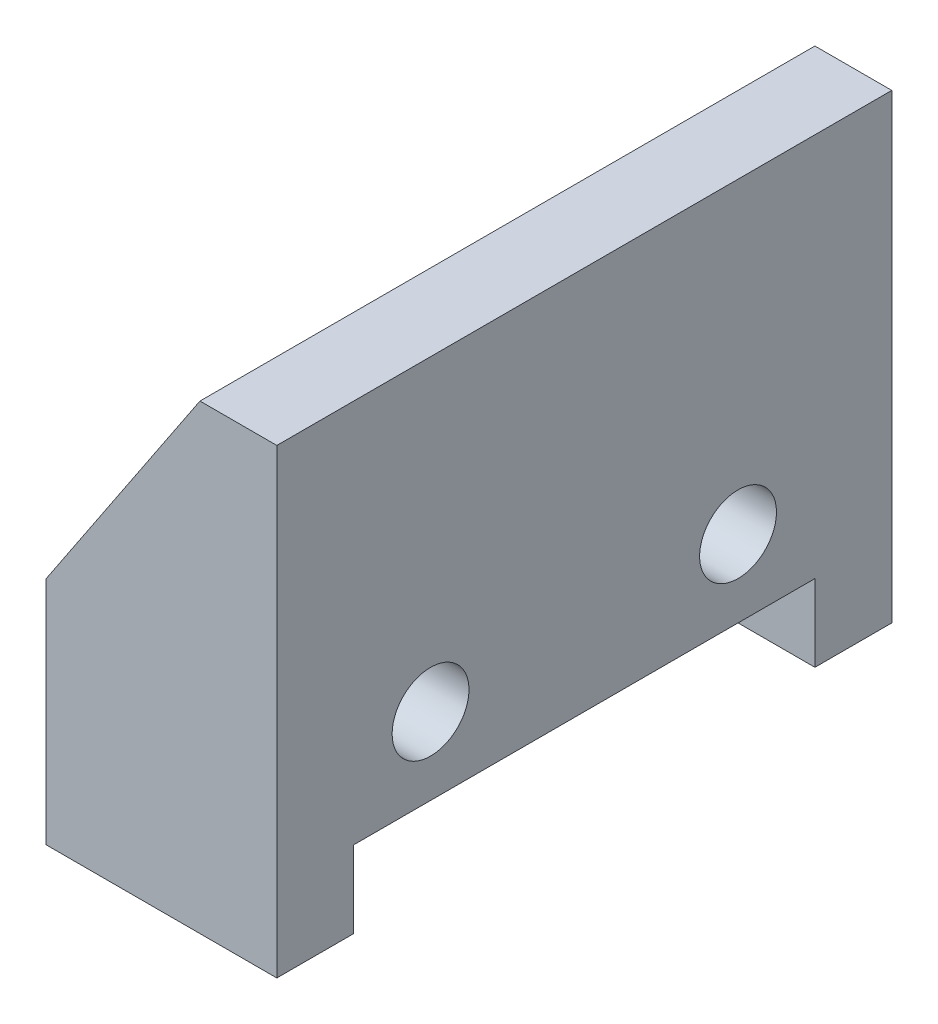
ISO-10303-21;
HEADER;
FILE_DESCRIPTION(('STEP AP214'),'2;1');
FILE_NAME('part.step','',(''),(''),'','','');
FILE_SCHEMA(('AUTOMOTIVE_DESIGN { 1 0 10303 214 1 1 1 1 }'));
ENDSEC;
DATA;
#1=APPLICATION_CONTEXT('core data for automotive mechanical design processes');
#2=APPLICATION_PROTOCOL_DEFINITION('international standard','automotive_design',2000,#1);
#3=PRODUCT_CONTEXT('',#1,'mechanical');
#4=PRODUCT('Part','Part','',(#3));
#5=PRODUCT_RELATED_PRODUCT_CATEGORY('part','',(#4));
#6=PRODUCT_DEFINITION_FORMATION('','',#4);
#7=PRODUCT_DEFINITION_CONTEXT('part definition',#1,'design');
#8=PRODUCT_DEFINITION('design','',#6,#7);
#9=PRODUCT_DEFINITION_SHAPE('','',#8);
#10=(LENGTH_UNIT() NAMED_UNIT(*) SI_UNIT(.MILLI.,.METRE.));
#11=(NAMED_UNIT(*) PLANE_ANGLE_UNIT() SI_UNIT($,.RADIAN.));
#12=(NAMED_UNIT(*) SI_UNIT($,.STERADIAN.) SOLID_ANGLE_UNIT());
#13=UNCERTAINTY_MEASURE_WITH_UNIT(LENGTH_MEASURE(1.E-05),#10,'distance_accuracy_value','');
#14=(GEOMETRIC_REPRESENTATION_CONTEXT(3) GLOBAL_UNCERTAINTY_ASSIGNED_CONTEXT((#13)) GLOBAL_UNIT_ASSIGNED_CONTEXT((#10,
#11,#12)) REPRESENTATION_CONTEXT('',''));
#15=CARTESIAN_POINT('',(0.,0.,0.));
#16=DIRECTION('',(0.,0.,1.));
#17=DIRECTION('',(1.,0.,0.));
#18=AXIS2_PLACEMENT_3D('',#15,#16,#17);
#19=CARTESIAN_POINT('',(0.,0.,20.));
#20=DIRECTION('',(0.,1.,0.));
#21=DIRECTION('',(0.,0.,1.));
#22=AXIS2_PLACEMENT_3D('',#19,#20,#21);
#23=PLANE('',#22);
#24=DIRECTION('',(0.,0.,-1.));
#25=VECTOR('',#24,1.);
#26=CARTESIAN_POINT('',(0.,0.,20.));
#27=LINE('',#26,#25);
#28=CARTESIAN_POINT('',(0.,0.,20.));
#29=VERTEX_POINT('',#28);
#30=CARTESIAN_POINT('',(0.,0.,15.));
#31=VERTEX_POINT('',#30);
#32=EDGE_CURVE('E11',#29,#31,#27,.T.);
#33=ORIENTED_EDGE('',*,*,#32,.T.);
#34=DIRECTION('',(1.,0.,0.));
#35=VECTOR('',#34,1.);
#36=CARTESIAN_POINT('',(0.,0.,15.));
#37=LINE('',#36,#35);
#38=CARTESIAN_POINT('',(15.,0.,15.));
#39=VERTEX_POINT('',#38);
#40=EDGE_CURVE('E199',#31,#39,#37,.T.);
#41=ORIENTED_EDGE('',*,*,#40,.T.);
#42=DIRECTION('',(0.,0.,-1.));
#43=VECTOR('',#42,1.);
#44=CARTESIAN_POINT('',(15.,0.,20.));
#45=LINE('',#44,#43);
#46=CARTESIAN_POINT('',(15.,0.,20.));
#47=VERTEX_POINT('',#46);
#48=EDGE_CURVE('E155',#47,#39,#45,.T.);
#49=ORIENTED_EDGE('',*,*,#48,.F.);
#50=DIRECTION('',(1.,0.,0.));
#51=VECTOR('',#50,1.);
#52=CARTESIAN_POINT('',(0.,0.,20.));
#53=LINE('',#52,#51);
#54=EDGE_CURVE('E99',#29,#47,#53,.T.);
#55=ORIENTED_EDGE('',*,*,#54,.F.);
#56=EDGE_LOOP('',(#33,#41,#49,#55));
#57=FACE_BOUND('',#56,.T.);
#58=ADVANCED_FACE('F42',(#57),#23,.F.);
#59=CARTESIAN_POINT('',(0.,0.,20.));
#60=DIRECTION('',(1.,0.,0.));
#61=DIRECTION('',(0.,0.,-1.));
#62=AXIS2_PLACEMENT_3D('',#59,#60,#61);
#63=PLANE('',#62);
#64=CARTESIAN_POINT('',(0.,10.,10.));
#65=DIRECTION('',(1.,0.,0.));
#66=DIRECTION('',(0.,0.,1.));
#67=AXIS2_PLACEMENT_3D('',#64,#65,#66);
#68=CIRCLE('',#67,2.5);
#69=CARTESIAN_POINT('',(0.,10.,12.5));
#70=VERTEX_POINT('',#69);
#71=EDGE_CURVE('E204',#70,#70,#68,.T.);
#72=ORIENTED_EDGE('',*,*,#71,.T.);
#73=EDGE_LOOP('',(#72));
#74=FACE_BOUND('',#73,.T.);
#75=CARTESIAN_POINT('',(0.,10.,-10.));
#76=DIRECTION('',(1.,0.,0.));
#77=DIRECTION('',(0.,0.,-1.));
#78=AXIS2_PLACEMENT_3D('',#75,#76,#77);
#79=CIRCLE('',#78,2.5);
#80=CARTESIAN_POINT('',(0.,10.,-12.5));
#81=VERTEX_POINT('',#80);
#82=EDGE_CURVE('E140',#81,#81,#79,.T.);
#83=ORIENTED_EDGE('',*,*,#82,.T.);
#84=EDGE_LOOP('',(#83));
#85=FACE_BOUND('',#84,.T.);
#86=DIRECTION('',(0.,0.,1.));
#87=VECTOR('',#86,1.);
#88=CARTESIAN_POINT('',(0.,5.00000000000001,15.));
#89=LINE('',#88,#87);
#90=CARTESIAN_POINT('',(0.,5.00000000000001,-15.));
#91=VERTEX_POINT('',#90);
#92=CARTESIAN_POINT('',(0.,5.00000000000001,15.));
#93=VERTEX_POINT('',#92);
#94=EDGE_CURVE('E196',#91,#93,#89,.T.);
#95=ORIENTED_EDGE('',*,*,#94,.T.);
#96=DIRECTION('',(0.,-1.,0.));
#97=VECTOR('',#96,1.);
#98=CARTESIAN_POINT('',(0.,0.,15.));
#99=LINE('',#98,#97);
#100=EDGE_CURVE('E188',#93,#31,#99,.T.);
#101=ORIENTED_EDGE('',*,*,#100,.T.);
#102=ORIENTED_EDGE('',*,*,#32,.F.);
#103=DIRECTION('',(0.,-1.,0.));
#104=VECTOR('',#103,1.);
#105=CARTESIAN_POINT('',(0.,0.,20.));
#106=LINE('',#105,#104);
#107=CARTESIAN_POINT('',(0.,15.,20.));
#108=VERTEX_POINT('',#107);
#109=EDGE_CURVE('E151',#108,#29,#106,.T.);
#110=ORIENTED_EDGE('',*,*,#109,.F.);
#111=DIRECTION('',(0.,0.,-1.));
#112=VECTOR('',#111,1.);
#113=CARTESIAN_POINT('',(0.,15.,20.));
#114=LINE('',#113,#112);
#115=CARTESIAN_POINT('',(0.,15.,-20.));
#116=VERTEX_POINT('',#115);
#117=EDGE_CURVE('E131',#108,#116,#114,.T.);
#118=ORIENTED_EDGE('',*,*,#117,.T.);
#119=DIRECTION('',(0.,-1.,0.));
#120=VECTOR('',#119,1.);
#121=CARTESIAN_POINT('',(0.,0.,-20.));
#122=LINE('',#121,#120);
#123=CARTESIAN_POINT('',(0.,0.,-20.));
#124=VERTEX_POINT('',#123);
#125=EDGE_CURVE('E135',#116,#124,#122,.T.);
#126=ORIENTED_EDGE('',*,*,#125,.T.);
#127=CARTESIAN_POINT('',(0.,0.,-15.));
#128=VERTEX_POINT('',#127);
#129=EDGE_CURVE('E51',#128,#124,#27,.T.);
#130=ORIENTED_EDGE('',*,*,#129,.F.);
#131=DIRECTION('',(0.,1.,0.));
#132=VECTOR('',#131,1.);
#133=CARTESIAN_POINT('',(0.,0.,-15.));
#134=LINE('',#133,#132);
#135=EDGE_CURVE('E192',#128,#91,#134,.T.);
#136=ORIENTED_EDGE('',*,*,#135,.T.);
#137=EDGE_LOOP('',(#95,#101,#102,#110,#118,#126,#130,#136));
#138=FACE_BOUND('',#137,.T.);
#139=ADVANCED_FACE('F44',(#74,#85,#138),#63,.F.);
#140=CARTESIAN_POINT('',(15.,0.,-15.));
#141=VERTEX_POINT('',#140);
#142=CARTESIAN_POINT('',(15.,0.,-20.));
#143=VERTEX_POINT('',#142);
#144=EDGE_CURVE('E124',#141,#143,#45,.T.);
#145=ORIENTED_EDGE('',*,*,#144,.F.);
#146=DIRECTION('',(1.,0.,0.));
#147=VECTOR('',#146,1.);
#148=CARTESIAN_POINT('',(0.,0.,-15.));
#149=LINE('',#148,#147);
#150=EDGE_CURVE('E58',#128,#141,#149,.T.);
#151=ORIENTED_EDGE('',*,*,#150,.F.);
#152=ORIENTED_EDGE('',*,*,#129,.T.);
#153=DIRECTION('',(1.,0.,0.));
#154=VECTOR('',#153,1.);
#155=CARTESIAN_POINT('',(0.,0.,-20.));
#156=LINE('',#155,#154);
#157=EDGE_CURVE('E139',#124,#143,#156,.T.);
#158=ORIENTED_EDGE('',*,*,#157,.T.);
#159=EDGE_LOOP('',(#145,#151,#152,#158));
#160=FACE_BOUND('',#159,.T.);
#161=ADVANCED_FACE('F165',(#160),#23,.F.);
#162=CARTESIAN_POINT('',(15.,0.,20.));
#163=DIRECTION('',(-1.,0.,0.));
#164=DIRECTION('',(0.,0.,1.));
#165=AXIS2_PLACEMENT_3D('',#162,#163,#164);
#166=PLANE('',#165);
#167=CARTESIAN_POINT('',(15.,10.,10.));
#168=DIRECTION('',(1.,0.,0.));
#169=DIRECTION('',(0.,0.,1.));
#170=AXIS2_PLACEMENT_3D('',#167,#168,#169);
#171=CIRCLE('',#170,2.5);
#172=CARTESIAN_POINT('',(15.,10.,12.5));
#173=VERTEX_POINT('',#172);
#174=EDGE_CURVE('E184',#173,#173,#171,.T.);
#175=ORIENTED_EDGE('',*,*,#174,.F.);
#176=EDGE_LOOP('',(#175));
#177=FACE_BOUND('',#176,.T.);
#178=CARTESIAN_POINT('',(15.,10.,-10.));
#179=DIRECTION('',(1.,0.,0.));
#180=DIRECTION('',(0.,0.,-1.));
#181=AXIS2_PLACEMENT_3D('',#178,#179,#180);
#182=CIRCLE('',#181,2.5);
#183=CARTESIAN_POINT('',(15.,10.,-12.5));
#184=VERTEX_POINT('',#183);
#185=EDGE_CURVE('E180',#184,#184,#182,.T.);
#186=ORIENTED_EDGE('',*,*,#185,.F.);
#187=EDGE_LOOP('',(#186));
#188=FACE_BOUND('',#187,.T.);
#189=ORIENTED_EDGE('',*,*,#48,.T.);
#190=DIRECTION('',(0.,-1.,0.));
#191=VECTOR('',#190,1.);
#192=CARTESIAN_POINT('',(15.,0.,15.));
#193=LINE('',#192,#191);
#194=CARTESIAN_POINT('',(15.,5.00000000000001,15.));
#195=VERTEX_POINT('',#194);
#196=EDGE_CURVE('E200',#195,#39,#193,.T.);
#197=ORIENTED_EDGE('',*,*,#196,.F.);
#198=DIRECTION('',(0.,0.,1.));
#199=VECTOR('',#198,1.);
#200=CARTESIAN_POINT('',(15.,5.00000000000001,15.));
#201=LINE('',#200,#199);
#202=CARTESIAN_POINT('',(15.,5.00000000000001,-15.));
#203=VERTEX_POINT('',#202);
#204=EDGE_CURVE('E191',#203,#195,#201,.T.);
#205=ORIENTED_EDGE('',*,*,#204,.F.);
#206=DIRECTION('',(0.,1.,0.));
#207=VECTOR('',#206,1.);
#208=CARTESIAN_POINT('',(15.,0.,-15.));
#209=LINE('',#208,#207);
#210=EDGE_CURVE('E162',#141,#203,#209,.T.);
#211=ORIENTED_EDGE('',*,*,#210,.F.);
#212=ORIENTED_EDGE('',*,*,#144,.T.);
#213=DIRECTION('',(0.,1.,0.));
#214=VECTOR('',#213,1.);
#215=CARTESIAN_POINT('',(15.,0.,-20.));
#216=LINE('',#215,#214);
#217=CARTESIAN_POINT('',(15.,30.,-20.));
#218=VERTEX_POINT('',#217);
#219=EDGE_CURVE('E120',#143,#218,#216,.T.);
#220=ORIENTED_EDGE('',*,*,#219,.T.);
#221=DIRECTION('',(0.,0.,-1.));
#222=VECTOR('',#221,1.);
#223=CARTESIAN_POINT('',(15.,30.,20.));
#224=LINE('',#223,#222);
#225=CARTESIAN_POINT('',(15.,30.,20.));
#226=VERTEX_POINT('',#225);
#227=EDGE_CURVE('E117',#226,#218,#224,.T.);
#228=ORIENTED_EDGE('',*,*,#227,.F.);
#229=DIRECTION('',(0.,1.,0.));
#230=VECTOR('',#229,1.);
#231=CARTESIAN_POINT('',(15.,0.,20.));
#232=LINE('',#231,#230);
#233=EDGE_CURVE('E106',#47,#226,#232,.T.);
#234=ORIENTED_EDGE('',*,*,#233,.F.);
#235=EDGE_LOOP('',(#189,#197,#205,#211,#212,#220,#228,#234));
#236=FACE_BOUND('',#235,.T.);
#237=ADVANCED_FACE('F118',(#177,#188,#236),#166,.F.);
#238=CARTESIAN_POINT('',(10.,30.,20.));
#239=DIRECTION('',(0.,-1.,0.));
#240=DIRECTION('',(0.,0.,-1.));
#241=AXIS2_PLACEMENT_3D('',#238,#239,#240);
#242=PLANE('',#241);
#243=DIRECTION('',(-1.,0.,0.));
#244=VECTOR('',#243,1.);
#245=CARTESIAN_POINT('',(10.,30.,-20.));
#246=LINE('',#245,#244);
#247=CARTESIAN_POINT('',(10.,30.,-20.));
#248=VERTEX_POINT('',#247);
#249=EDGE_CURVE('E146',#218,#248,#246,.T.);
#250=ORIENTED_EDGE('',*,*,#249,.T.);
#251=DIRECTION('',(0.,0.,-1.));
#252=VECTOR('',#251,1.);
#253=CARTESIAN_POINT('',(10.,30.,20.));
#254=LINE('',#253,#252);
#255=CARTESIAN_POINT('',(10.,30.,20.));
#256=VERTEX_POINT('',#255);
#257=EDGE_CURVE('E125',#256,#248,#254,.T.);
#258=ORIENTED_EDGE('',*,*,#257,.F.);
#259=DIRECTION('',(-1.,0.,0.));
#260=VECTOR('',#259,1.);
#261=CARTESIAN_POINT('',(10.,30.,20.));
#262=LINE('',#261,#260);
#263=EDGE_CURVE('E110',#226,#256,#262,.T.);
#264=ORIENTED_EDGE('',*,*,#263,.F.);
#265=ORIENTED_EDGE('',*,*,#227,.T.);
#266=EDGE_LOOP('',(#250,#258,#264,#265));
#267=FACE_BOUND('',#266,.T.);
#268=ADVANCED_FACE('F127',(#267),#242,.F.);
#269=CARTESIAN_POINT('',(0.,15.,20.));
#270=DIRECTION('',(0.832050294337844,-0.554700196225229,0.));
#271=DIRECTION('',(0.554700196225229,0.832050294337844,0.));
#272=AXIS2_PLACEMENT_3D('',#269,#270,#271);
#273=PLANE('',#272);
#274=DIRECTION('',(-0.554700196225229,-0.832050294337844,0.));
#275=VECTOR('',#274,1.);
#276=CARTESIAN_POINT('',(0.,15.,-20.));
#277=LINE('',#276,#275);
#278=EDGE_CURVE('E91',#248,#116,#277,.T.);
#279=ORIENTED_EDGE('',*,*,#278,.T.);
#280=ORIENTED_EDGE('',*,*,#117,.F.);
#281=DIRECTION('',(-0.554700196225229,-0.832050294337844,0.));
#282=VECTOR('',#281,1.);
#283=CARTESIAN_POINT('',(0.,15.,20.));
#284=LINE('',#283,#282);
#285=EDGE_CURVE('E67',#256,#108,#284,.T.);
#286=ORIENTED_EDGE('',*,*,#285,.F.);
#287=ORIENTED_EDGE('',*,*,#257,.T.);
#288=EDGE_LOOP('',(#279,#280,#286,#287));
#289=FACE_BOUND('',#288,.T.);
#290=ADVANCED_FACE('F170',(#289),#273,.F.);
#291=CARTESIAN_POINT('',(0.,0.,20.));
#292=DIRECTION('',(0.,0.,-1.));
#293=DIRECTION('',(-1.,0.,0.));
#294=AXIS2_PLACEMENT_3D('',#291,#292,#293);
#295=PLANE('',#294);
#296=ORIENTED_EDGE('',*,*,#109,.T.);
#297=ORIENTED_EDGE('',*,*,#54,.T.);
#298=ORIENTED_EDGE('',*,*,#233,.T.);
#299=ORIENTED_EDGE('',*,*,#263,.T.);
#300=ORIENTED_EDGE('',*,*,#285,.T.);
#301=EDGE_LOOP('',(#296,#297,#298,#299,#300));
#302=FACE_BOUND('',#301,.T.);
#303=ADVANCED_FACE('F108',(#302),#295,.F.);
#304=CARTESIAN_POINT('',(0.,0.,-20.));
#305=DIRECTION('',(0.,0.,-1.));
#306=DIRECTION('',(-1.,0.,0.));
#307=AXIS2_PLACEMENT_3D('',#304,#305,#306);
#308=PLANE('',#307);
#309=ORIENTED_EDGE('',*,*,#125,.F.);
#310=ORIENTED_EDGE('',*,*,#278,.F.);
#311=ORIENTED_EDGE('',*,*,#249,.F.);
#312=ORIENTED_EDGE('',*,*,#219,.F.);
#313=ORIENTED_EDGE('',*,*,#157,.F.);
#314=EDGE_LOOP('',(#309,#310,#311,#312,#313));
#315=FACE_BOUND('',#314,.T.);
#316=ADVANCED_FACE('F169',(#315),#308,.T.);
#317=CARTESIAN_POINT('',(0.,10.,-10.));
#318=DIRECTION('',(1.,0.,0.));
#319=DIRECTION('',(0.,0.,-1.));
#320=AXIS2_PLACEMENT_3D('',#317,#318,#319);
#321=CYLINDRICAL_SURFACE('',#320,2.5);
#322=ORIENTED_EDGE('',*,*,#82,.F.);
#323=EDGE_LOOP('',(#322));
#324=FACE_BOUND('',#323,.T.);
#325=ORIENTED_EDGE('',*,*,#185,.T.);
#326=EDGE_LOOP('',(#325));
#327=FACE_BOUND('',#326,.T.);
#328=ADVANCED_FACE('F237',(#324,#327),#321,.F.);
#329=CARTESIAN_POINT('',(0.,10.,10.));
#330=DIRECTION('',(1.,0.,0.));
#331=DIRECTION('',(0.,0.,-1.));
#332=AXIS2_PLACEMENT_3D('',#329,#330,#331);
#333=CYLINDRICAL_SURFACE('',#332,2.5);
#334=ORIENTED_EDGE('',*,*,#71,.F.);
#335=EDGE_LOOP('',(#334));
#336=FACE_BOUND('',#335,.T.);
#337=ORIENTED_EDGE('',*,*,#174,.T.);
#338=EDGE_LOOP('',(#337));
#339=FACE_BOUND('',#338,.T.);
#340=ADVANCED_FACE('F230',(#336,#339),#333,.F.);
#341=CARTESIAN_POINT('',(0.,0.,15.));
#342=DIRECTION('',(0.,0.,1.));
#343=DIRECTION('',(1.,0.,0.));
#344=AXIS2_PLACEMENT_3D('',#341,#342,#343);
#345=PLANE('',#344);
#346=ORIENTED_EDGE('',*,*,#196,.T.);
#347=ORIENTED_EDGE('',*,*,#40,.F.);
#348=ORIENTED_EDGE('',*,*,#100,.F.);
#349=DIRECTION('',(1.,0.,0.));
#350=VECTOR('',#349,1.);
#351=CARTESIAN_POINT('',(0.,5.00000000000001,15.));
#352=LINE('',#351,#350);
#353=EDGE_CURVE('E210',#93,#195,#352,.T.);
#354=ORIENTED_EDGE('',*,*,#353,.T.);
#355=EDGE_LOOP('',(#346,#347,#348,#354));
#356=FACE_BOUND('',#355,.T.);
#357=ADVANCED_FACE('F245',(#356),#345,.F.);
#358=CARTESIAN_POINT('',(0.,5.00000000000001,15.));
#359=DIRECTION('',(0.,1.,0.));
#360=DIRECTION('',(0.,0.,1.));
#361=AXIS2_PLACEMENT_3D('',#358,#359,#360);
#362=PLANE('',#361);
#363=ORIENTED_EDGE('',*,*,#204,.T.);
#364=ORIENTED_EDGE('',*,*,#353,.F.);
#365=ORIENTED_EDGE('',*,*,#94,.F.);
#366=DIRECTION('',(1.,0.,0.));
#367=VECTOR('',#366,1.);
#368=CARTESIAN_POINT('',(0.,5.00000000000001,-15.));
#369=LINE('',#368,#367);
#370=EDGE_CURVE('E214',#91,#203,#369,.T.);
#371=ORIENTED_EDGE('',*,*,#370,.T.);
#372=EDGE_LOOP('',(#363,#364,#365,#371));
#373=FACE_BOUND('',#372,.T.);
#374=ADVANCED_FACE('F289',(#373),#362,.F.);
#375=CARTESIAN_POINT('',(0.,0.,-15.));
#376=DIRECTION('',(0.,0.,-1.));
#377=DIRECTION('',(0.,1.,0.));
#378=AXIS2_PLACEMENT_3D('',#375,#376,#377);
#379=PLANE('',#378);
#380=ORIENTED_EDGE('',*,*,#210,.T.);
#381=ORIENTED_EDGE('',*,*,#370,.F.);
#382=ORIENTED_EDGE('',*,*,#135,.F.);
#383=ORIENTED_EDGE('',*,*,#150,.T.);
#384=EDGE_LOOP('',(#380,#381,#382,#383));
#385=FACE_BOUND('',#384,.T.);
#386=ADVANCED_FACE('F300',(#385),#379,.F.);
#387=CLOSED_SHELL('',(#58,#139,#161,#237,#268,#290,#303,#316,#328,#340,#357,#374,#386));
#388=MANIFOLD_SOLID_BREP('B2',#387);
#389=ADVANCED_BREP_SHAPE_REPRESENTATION('',(#18,#388),#14);
#390=SHAPE_DEFINITION_REPRESENTATION(#9,#389);
ENDSEC;
END-ISO-10303-21;
